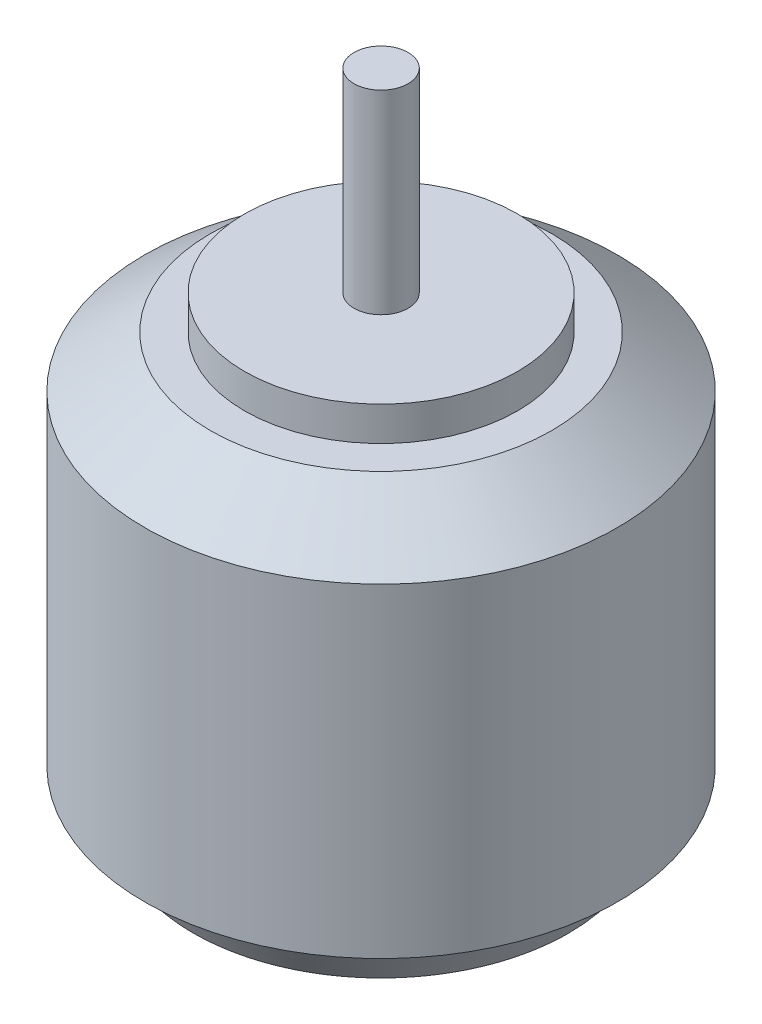
ISO-10303-21;
HEADER;
FILE_DESCRIPTION(('STEP AP214'),'2;1');
FILE_NAME('part.step','',(''),(''),'','','');
FILE_SCHEMA(('AUTOMOTIVE_DESIGN { 1 0 10303 214 1 1 1 1 }'));
ENDSEC;
DATA;
#1=APPLICATION_CONTEXT('core data for automotive mechanical design processes');
#2=APPLICATION_PROTOCOL_DEFINITION('international standard','automotive_design',2000,#1);
#3=PRODUCT_CONTEXT('',#1,'mechanical');
#4=PRODUCT('Part','Part','',(#3));
#5=PRODUCT_RELATED_PRODUCT_CATEGORY('part','',(#4));
#6=PRODUCT_DEFINITION_FORMATION('','',#4);
#7=PRODUCT_DEFINITION_CONTEXT('part definition',#1,'design');
#8=PRODUCT_DEFINITION('design','',#6,#7);
#9=PRODUCT_DEFINITION_SHAPE('','',#8);
#10=(LENGTH_UNIT() NAMED_UNIT(*) SI_UNIT(.MILLI.,.METRE.));
#11=(NAMED_UNIT(*) PLANE_ANGLE_UNIT() SI_UNIT($,.RADIAN.));
#12=(NAMED_UNIT(*) SI_UNIT($,.STERADIAN.) SOLID_ANGLE_UNIT());
#13=UNCERTAINTY_MEASURE_WITH_UNIT(LENGTH_MEASURE(1.E-05),#10,'distance_accuracy_value','');
#14=(GEOMETRIC_REPRESENTATION_CONTEXT(3) GLOBAL_UNCERTAINTY_ASSIGNED_CONTEXT((#13)) GLOBAL_UNIT_ASSIGNED_CONTEXT((#10,
#11,#12)) REPRESENTATION_CONTEXT('',''));
#15=CARTESIAN_POINT('',(0.,0.,0.));
#16=DIRECTION('',(0.,0.,1.));
#17=DIRECTION('',(1.,0.,0.));
#18=AXIS2_PLACEMENT_3D('',#15,#16,#17);
#19=CARTESIAN_POINT('',(0.,0.,0.));
#20=DIRECTION('',(0.,1.,0.));
#21=DIRECTION('',(-1.,0.,0.));
#22=AXIS2_PLACEMENT_3D('',#19,#20,#21);
#23=PLANE('',#22);
#24=CARTESIAN_POINT('',(-8.,0.,0.));
#25=DIRECTION('',(0.,-1.,0.));
#26=DIRECTION('',(1.,0.,0.));
#27=AXIS2_PLACEMENT_3D('',#24,#25,#26);
#28=CIRCLE('',#27,1.5);
#29=CARTESIAN_POINT('',(-6.5,0.,0.));
#30=VERTEX_POINT('',#29);
#31=EDGE_CURVE('E81',#30,#30,#28,.T.);
#32=ORIENTED_EDGE('',*,*,#31,.F.);
#33=EDGE_LOOP('',(#32));
#34=FACE_BOUND('',#33,.T.);
#35=CARTESIAN_POINT('',(0.,0.,0.));
#36=DIRECTION('',(0.,1.,0.));
#37=DIRECTION('',(-1.,0.,0.));
#38=AXIS2_PLACEMENT_3D('',#35,#36,#37);
#39=CIRCLE('',#38,11.);
#40=CARTESIAN_POINT('',(0.,0.,11.));
#41=VERTEX_POINT('',#40);
#42=CARTESIAN_POINT('',(11.,0.,0.));
#43=VERTEX_POINT('',#42);
#44=EDGE_CURVE('E11',#41,#43,#39,.T.);
#45=ORIENTED_EDGE('',*,*,#44,.F.);
#46=CARTESIAN_POINT('',(0.,0.,9.5));
#47=DIRECTION('',(0.,-1.,0.));
#48=DIRECTION('',(1.,0.,0.));
#49=AXIS2_PLACEMENT_3D('',#46,#47,#48);
#50=CIRCLE('',#49,1.5);
#51=EDGE_CURVE('E58',#41,#41,#50,.T.);
#52=ORIENTED_EDGE('',*,*,#51,.F.);
#53=CARTESIAN_POINT('',(0.,0.,-11.));
#54=VERTEX_POINT('',#53);
#55=EDGE_CURVE('E43',#54,#41,#39,.T.);
#56=ORIENTED_EDGE('',*,*,#55,.F.);
#57=CARTESIAN_POINT('',(0.,0.,-9.5));
#58=DIRECTION('',(0.,-1.,0.));
#59=DIRECTION('',(1.,0.,0.));
#60=AXIS2_PLACEMENT_3D('',#57,#58,#59);
#61=CIRCLE('',#60,1.5);
#62=EDGE_CURVE('E48',#54,#54,#61,.T.);
#63=ORIENTED_EDGE('',*,*,#62,.F.);
#64=EDGE_CURVE('E42',#43,#54,#39,.T.);
#65=ORIENTED_EDGE('',*,*,#64,.F.);
#66=CARTESIAN_POINT('',(9.5,0.,0.));
#67=DIRECTION('',(0.,-1.,0.));
#68=DIRECTION('',(1.,0.,0.));
#69=AXIS2_PLACEMENT_3D('',#66,#67,#68);
#70=CIRCLE('',#69,1.5);
#71=EDGE_CURVE('E53',#43,#43,#70,.T.);
#72=ORIENTED_EDGE('',*,*,#71,.F.);
#73=EDGE_LOOP('',(#45,#52,#56,#63,#65,#72));
#74=FACE_BOUND('',#73,.T.);
#75=ADVANCED_FACE('F35',(#34,#74),#23,.F.);
#76=CARTESIAN_POINT('',(0.,0.,0.));
#77=DIRECTION('',(0.,1.,0.));
#78=DIRECTION('',(-1.,0.,0.));
#79=AXIS2_PLACEMENT_3D('',#76,#77,#78);
#80=CONICAL_SURFACE('',#79,11.,0.523598775598296);
#81=CARTESIAN_POINT('',(0.,3.,0.));
#82=DIRECTION('',(0.,1.,0.));
#83=DIRECTION('',(-1.,0.,0.));
#84=AXIS2_PLACEMENT_3D('',#81,#82,#83);
#85=CIRCLE('',#84,12.7320508075689);
#86=CARTESIAN_POINT('',(-12.7320508075689,3.,0.));
#87=VERTEX_POINT('',#86);
#88=EDGE_CURVE('E103',#87,#87,#85,.T.);
#89=ORIENTED_EDGE('',*,*,#88,.F.);
#90=EDGE_LOOP('',(#89));
#91=FACE_BOUND('',#90,.T.);
#92=ORIENTED_EDGE('',*,*,#44,.T.);
#93=ORIENTED_EDGE('',*,*,#64,.T.);
#94=ORIENTED_EDGE('',*,*,#55,.T.);
#95=EDGE_LOOP('',(#92,#93,#94));
#96=FACE_BOUND('',#95,.T.);
#97=ADVANCED_FACE('F110',(#91,#96),#80,.T.);
#98=CARTESIAN_POINT('',(12.7320508075689,3.,0.));
#99=DIRECTION('',(0.,1.,0.));
#100=DIRECTION('',(-1.,0.,0.));
#101=AXIS2_PLACEMENT_3D('',#98,#99,#100);
#102=PLANE('',#101);
#103=CARTESIAN_POINT('',(0.,3.,0.));
#104=DIRECTION('',(0.,1.,0.));
#105=DIRECTION('',(-1.,0.,0.));
#106=AXIS2_PLACEMENT_3D('',#103,#104,#105);
#107=CIRCLE('',#106,13.85);
#108=CARTESIAN_POINT('',(-13.85,3.,0.));
#109=VERTEX_POINT('',#108);
#110=EDGE_CURVE('E101',#109,#109,#107,.T.);
#111=ORIENTED_EDGE('',*,*,#110,.F.);
#112=EDGE_LOOP('',(#111));
#113=FACE_BOUND('',#112,.T.);
#114=ORIENTED_EDGE('',*,*,#88,.T.);
#115=EDGE_LOOP('',(#114));
#116=FACE_BOUND('',#115,.T.);
#117=ADVANCED_FACE('F116',(#113,#116),#102,.F.);
#118=CARTESIAN_POINT('',(0.,38.4,0.));
#119=DIRECTION('',(0.,1.,0.));
#120=DIRECTION('',(-1.,0.,0.));
#121=AXIS2_PLACEMENT_3D('',#118,#119,#120);
#122=CYLINDRICAL_SURFACE('',#121,13.85);
#123=CARTESIAN_POINT('',(0.,22.,0.));
#124=DIRECTION('',(0.,1.,0.));
#125=DIRECTION('',(-1.,0.,0.));
#126=AXIS2_PLACEMENT_3D('',#123,#124,#125);
#127=CIRCLE('',#126,13.85);
#128=CARTESIAN_POINT('',(-13.85,22.,0.));
#129=VERTEX_POINT('',#128);
#130=EDGE_CURVE('E98',#129,#129,#127,.T.);
#131=ORIENTED_EDGE('',*,*,#130,.F.);
#132=EDGE_LOOP('',(#131));
#133=FACE_BOUND('',#132,.T.);
#134=ORIENTED_EDGE('',*,*,#110,.T.);
#135=EDGE_LOOP('',(#134));
#136=FACE_BOUND('',#135,.T.);
#137=ADVANCED_FACE('F157',(#133,#136),#122,.T.);
#138=CARTESIAN_POINT('',(0.,22.,0.));
#139=DIRECTION('',(0.,-1.,0.));
#140=DIRECTION('',(1.,0.,0.));
#141=AXIS2_PLACEMENT_3D('',#138,#139,#140);
#142=CONICAL_SURFACE('',#141,13.85,0.908854685589389);
#143=CARTESIAN_POINT('',(0.,25.,0.));
#144=DIRECTION('',(0.,1.,0.));
#145=DIRECTION('',(-1.,0.,0.));
#146=AXIS2_PLACEMENT_3D('',#143,#144,#145);
#147=CIRCLE('',#146,10.);
#148=CARTESIAN_POINT('',(-10.,25.,0.));
#149=VERTEX_POINT('',#148);
#150=EDGE_CURVE('E95',#149,#149,#147,.T.);
#151=ORIENTED_EDGE('',*,*,#150,.F.);
#152=EDGE_LOOP('',(#151));
#153=FACE_BOUND('',#152,.T.);
#154=ORIENTED_EDGE('',*,*,#130,.T.);
#155=EDGE_LOOP('',(#154));
#156=FACE_BOUND('',#155,.T.);
#157=ADVANCED_FACE('F153',(#153,#156),#142,.T.);
#158=CARTESIAN_POINT('',(10.,25.,0.));
#159=DIRECTION('',(0.,-1.,0.));
#160=DIRECTION('',(1.,0.,0.));
#161=AXIS2_PLACEMENT_3D('',#158,#159,#160);
#162=PLANE('',#161);
#163=CARTESIAN_POINT('',(0.,25.,0.));
#164=DIRECTION('',(0.,1.,0.));
#165=DIRECTION('',(-1.,0.,0.));
#166=AXIS2_PLACEMENT_3D('',#163,#164,#165);
#167=CIRCLE('',#166,8.);
#168=CARTESIAN_POINT('',(-8.,25.,0.));
#169=VERTEX_POINT('',#168);
#170=EDGE_CURVE('E92',#169,#169,#167,.T.);
#171=ORIENTED_EDGE('',*,*,#170,.F.);
#172=EDGE_LOOP('',(#171));
#173=FACE_BOUND('',#172,.T.);
#174=ORIENTED_EDGE('',*,*,#150,.T.);
#175=EDGE_LOOP('',(#174));
#176=FACE_BOUND('',#175,.T.);
#177=ADVANCED_FACE('F149',(#173,#176),#162,.F.);
#178=CARTESIAN_POINT('',(0.,38.4,0.));
#179=DIRECTION('',(0.,1.,0.));
#180=DIRECTION('',(-1.,0.,0.));
#181=AXIS2_PLACEMENT_3D('',#178,#179,#180);
#182=CYLINDRICAL_SURFACE('',#181,8.);
#183=CARTESIAN_POINT('',(0.,27.,0.));
#184=DIRECTION('',(0.,1.,0.));
#185=DIRECTION('',(-1.,0.,0.));
#186=AXIS2_PLACEMENT_3D('',#183,#184,#185);
#187=CIRCLE('',#186,8.);
#188=CARTESIAN_POINT('',(-8.,27.,0.));
#189=VERTEX_POINT('',#188);
#190=EDGE_CURVE('E89',#189,#189,#187,.T.);
#191=ORIENTED_EDGE('',*,*,#190,.F.);
#192=EDGE_LOOP('',(#191));
#193=FACE_BOUND('',#192,.T.);
#194=ORIENTED_EDGE('',*,*,#170,.T.);
#195=EDGE_LOOP('',(#194));
#196=FACE_BOUND('',#195,.T.);
#197=ADVANCED_FACE('F145',(#193,#196),#182,.T.);
#198=CARTESIAN_POINT('',(8.,27.,0.));
#199=DIRECTION('',(0.,-1.,0.));
#200=DIRECTION('',(1.,0.,0.));
#201=AXIS2_PLACEMENT_3D('',#198,#199,#200);
#202=PLANE('',#201);
#203=CARTESIAN_POINT('',(0.,27.,0.));
#204=DIRECTION('',(0.,1.,0.));
#205=DIRECTION('',(-1.,0.,0.));
#206=AXIS2_PLACEMENT_3D('',#203,#204,#205);
#207=CIRCLE('',#206,1.585);
#208=CARTESIAN_POINT('',(-1.585,27.,0.));
#209=VERTEX_POINT('',#208);
#210=EDGE_CURVE('E86',#209,#209,#207,.T.);
#211=ORIENTED_EDGE('',*,*,#210,.F.);
#212=EDGE_LOOP('',(#211));
#213=FACE_BOUND('',#212,.T.);
#214=ORIENTED_EDGE('',*,*,#190,.T.);
#215=EDGE_LOOP('',(#214));
#216=FACE_BOUND('',#215,.T.);
#217=ADVANCED_FACE('F141',(#213,#216),#202,.F.);
#218=CARTESIAN_POINT('',(0.,38.4,0.));
#219=DIRECTION('',(0.,1.,0.));
#220=DIRECTION('',(-1.,0.,0.));
#221=AXIS2_PLACEMENT_3D('',#218,#219,#220);
#222=CYLINDRICAL_SURFACE('',#221,1.585);
#223=CARTESIAN_POINT('',(0.,38.4,0.));
#224=DIRECTION('',(0.,1.,0.));
#225=DIRECTION('',(-1.,0.,0.));
#226=AXIS2_PLACEMENT_3D('',#223,#224,#225);
#227=CIRCLE('',#226,1.585);
#228=CARTESIAN_POINT('',(-1.585,38.4,0.));
#229=VERTEX_POINT('',#228);
#230=EDGE_CURVE('E68',#229,#229,#227,.T.);
#231=ORIENTED_EDGE('',*,*,#230,.F.);
#232=EDGE_LOOP('',(#231));
#233=FACE_BOUND('',#232,.T.);
#234=ORIENTED_EDGE('',*,*,#210,.T.);
#235=EDGE_LOOP('',(#234));
#236=FACE_BOUND('',#235,.T.);
#237=ADVANCED_FACE('F133',(#233,#236),#222,.T.);
#238=CARTESIAN_POINT('',(1.585,38.4,0.));
#239=DIRECTION('',(0.,-1.,0.));
#240=DIRECTION('',(1.,0.,0.));
#241=AXIS2_PLACEMENT_3D('',#238,#239,#240);
#242=PLANE('',#241);
#243=ORIENTED_EDGE('',*,*,#230,.T.);
#244=EDGE_LOOP('',(#243));
#245=FACE_BOUND('',#244,.T.);
#246=ADVANCED_FACE('F123',(#245),#242,.F.);
#247=CARTESIAN_POINT('',(-8.,10.,0.));
#248=DIRECTION('',(0.,-1.,0.));
#249=DIRECTION('',(1.,0.,0.));
#250=AXIS2_PLACEMENT_3D('',#247,#248,#249);
#251=CYLINDRICAL_SURFACE('',#250,1.5);
#252=CARTESIAN_POINT('',(-8.,10.,0.));
#253=DIRECTION('',(0.,-1.,0.));
#254=DIRECTION('',(1.,0.,0.));
#255=AXIS2_PLACEMENT_3D('',#252,#253,#254);
#256=CIRCLE('',#255,1.5);
#257=CARTESIAN_POINT('',(-6.5,10.,0.));
#258=VERTEX_POINT('',#257);
#259=EDGE_CURVE('E78',#258,#258,#256,.T.);
#260=ORIENTED_EDGE('',*,*,#259,.F.);
#261=EDGE_LOOP('',(#260));
#262=FACE_BOUND('',#261,.T.);
#263=ORIENTED_EDGE('',*,*,#31,.T.);
#264=EDGE_LOOP('',(#263));
#265=FACE_BOUND('',#264,.T.);
#266=ADVANCED_FACE('F120',(#262,#265),#251,.F.);
#267=CARTESIAN_POINT('',(-8.,10.,0.));
#268=DIRECTION('',(0.,-1.,0.));
#269=DIRECTION('',(1.,0.,0.));
#270=AXIS2_PLACEMENT_3D('',#267,#268,#269);
#271=PLANE('',#270);
#272=ORIENTED_EDGE('',*,*,#259,.T.);
#273=EDGE_LOOP('',(#272));
#274=FACE_BOUND('',#273,.T.);
#275=ADVANCED_FACE('F122',(#274),#271,.T.);
#276=CARTESIAN_POINT('',(9.5,10.,0.));
#277=DIRECTION('',(0.,-1.,0.));
#278=DIRECTION('',(1.,0.,0.));
#279=AXIS2_PLACEMENT_3D('',#276,#277,#278);
#280=CYLINDRICAL_SURFACE('',#279,1.5);
#281=CARTESIAN_POINT('',(9.5,10.,0.));
#282=DIRECTION('',(0.,-1.,0.));
#283=DIRECTION('',(1.,0.,0.));
#284=AXIS2_PLACEMENT_3D('',#281,#282,#283);
#285=CIRCLE('',#284,1.5);
#286=CARTESIAN_POINT('',(11.,10.,0.));
#287=VERTEX_POINT('',#286);
#288=EDGE_CURVE('E74',#287,#287,#285,.T.);
#289=ORIENTED_EDGE('',*,*,#288,.F.);
#290=EDGE_LOOP('',(#289));
#291=FACE_BOUND('',#290,.T.);
#292=ORIENTED_EDGE('',*,*,#71,.T.);
#293=EDGE_LOOP('',(#292));
#294=FACE_BOUND('',#293,.T.);
#295=ADVANCED_FACE('F130',(#291,#294),#280,.F.);
#296=CARTESIAN_POINT('',(9.5,10.,0.));
#297=DIRECTION('',(0.,-1.,0.));
#298=DIRECTION('',(1.,0.,0.));
#299=AXIS2_PLACEMENT_3D('',#296,#297,#298);
#300=PLANE('',#299);
#301=ORIENTED_EDGE('',*,*,#288,.T.);
#302=EDGE_LOOP('',(#301));
#303=FACE_BOUND('',#302,.T.);
#304=ADVANCED_FACE('F225',(#303),#300,.T.);
#305=CARTESIAN_POINT('',(0.,10.,-9.5));
#306=DIRECTION('',(0.,-1.,0.));
#307=DIRECTION('',(1.,0.,0.));
#308=AXIS2_PLACEMENT_3D('',#305,#306,#307);
#309=CYLINDRICAL_SURFACE('',#308,1.5);
#310=CARTESIAN_POINT('',(0.,10.,-9.5));
#311=DIRECTION('',(0.,-1.,0.));
#312=DIRECTION('',(1.,0.,0.));
#313=AXIS2_PLACEMENT_3D('',#310,#311,#312);
#314=CIRCLE('',#313,1.5);
#315=CARTESIAN_POINT('',(1.5,10.,-9.5));
#316=VERTEX_POINT('',#315);
#317=EDGE_CURVE('E65',#316,#316,#314,.T.);
#318=ORIENTED_EDGE('',*,*,#317,.F.);
#319=EDGE_LOOP('',(#318));
#320=FACE_BOUND('',#319,.T.);
#321=ORIENTED_EDGE('',*,*,#62,.T.);
#322=EDGE_LOOP('',(#321));
#323=FACE_BOUND('',#322,.T.);
#324=ADVANCED_FACE('F234',(#320,#323),#309,.F.);
#325=CARTESIAN_POINT('',(0.,10.,-9.5));
#326=DIRECTION('',(0.,-1.,0.));
#327=DIRECTION('',(1.,0.,0.));
#328=AXIS2_PLACEMENT_3D('',#325,#326,#327);
#329=PLANE('',#328);
#330=ORIENTED_EDGE('',*,*,#317,.T.);
#331=EDGE_LOOP('',(#330));
#332=FACE_BOUND('',#331,.T.);
#333=ADVANCED_FACE('F244',(#332),#329,.T.);
#334=CARTESIAN_POINT('',(0.,10.,9.5));
#335=DIRECTION('',(0.,-1.,0.));
#336=DIRECTION('',(1.,0.,0.));
#337=AXIS2_PLACEMENT_3D('',#334,#335,#336);
#338=CYLINDRICAL_SURFACE('',#337,1.5);
#339=CARTESIAN_POINT('',(0.,10.,9.5));
#340=DIRECTION('',(0.,-1.,0.));
#341=DIRECTION('',(1.,0.,0.));
#342=AXIS2_PLACEMENT_3D('',#339,#340,#341);
#343=CIRCLE('',#342,1.5);
#344=CARTESIAN_POINT('',(1.5,10.,9.5));
#345=VERTEX_POINT('',#344);
#346=EDGE_CURVE('E64',#345,#345,#343,.T.);
#347=ORIENTED_EDGE('',*,*,#346,.F.);
#348=EDGE_LOOP('',(#347));
#349=FACE_BOUND('',#348,.T.);
#350=ORIENTED_EDGE('',*,*,#51,.T.);
#351=EDGE_LOOP('',(#350));
#352=FACE_BOUND('',#351,.T.);
#353=ADVANCED_FACE('F59',(#349,#352),#338,.F.);
#354=CARTESIAN_POINT('',(0.,10.,9.5));
#355=DIRECTION('',(0.,-1.,0.));
#356=DIRECTION('',(1.,0.,0.));
#357=AXIS2_PLACEMENT_3D('',#354,#355,#356);
#358=PLANE('',#357);
#359=ORIENTED_EDGE('',*,*,#346,.T.);
#360=EDGE_LOOP('',(#359));
#361=FACE_BOUND('',#360,.T.);
#362=ADVANCED_FACE('F263',(#361),#358,.T.);
#363=CLOSED_SHELL('',(#75,#97,#117,#137,#157,#177,#197,#217,#237,#246,#266,#275,#295,#304,#324,
#333,#353,#362));
#364=MANIFOLD_SOLID_BREP('B2',#363);
#365=ADVANCED_BREP_SHAPE_REPRESENTATION('',(#18,#364),#14);
#366=SHAPE_DEFINITION_REPRESENTATION(#9,#365);
ENDSEC;
END-ISO-10303-21;
